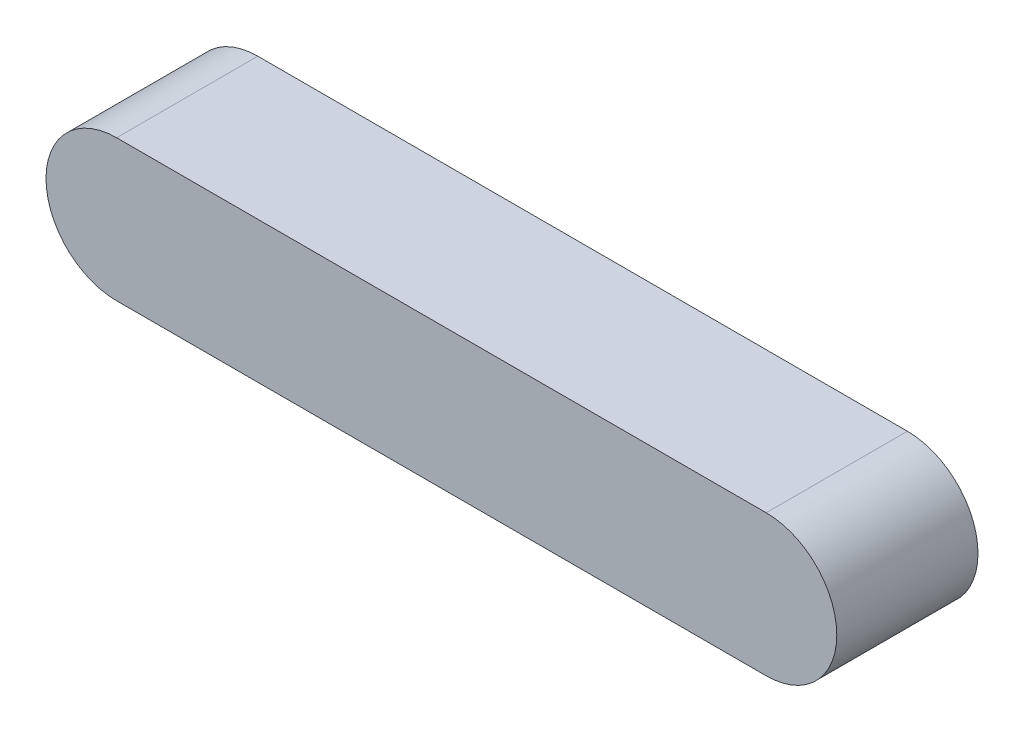
ISO-10303-21;
HEADER;
FILE_DESCRIPTION(('STEP AP214'),'2;1');
FILE_NAME('part.step','',(''),(''),'','','');
FILE_SCHEMA(('AUTOMOTIVE_DESIGN { 1 0 10303 214 1 1 1 1 }'));
ENDSEC;
DATA;
#1=APPLICATION_CONTEXT('core data for automotive mechanical design processes');
#2=APPLICATION_PROTOCOL_DEFINITION('international standard','automotive_design',2000,#1);
#3=PRODUCT_CONTEXT('',#1,'mechanical');
#4=PRODUCT('Part','Part','',(#3));
#5=PRODUCT_RELATED_PRODUCT_CATEGORY('part','',(#4));
#6=PRODUCT_DEFINITION_FORMATION('','',#4);
#7=PRODUCT_DEFINITION_CONTEXT('part definition',#1,'design');
#8=PRODUCT_DEFINITION('design','',#6,#7);
#9=PRODUCT_DEFINITION_SHAPE('','',#8);
#10=(LENGTH_UNIT() NAMED_UNIT(*) SI_UNIT(.MILLI.,.METRE.));
#11=(NAMED_UNIT(*) PLANE_ANGLE_UNIT() SI_UNIT($,.RADIAN.));
#12=(NAMED_UNIT(*) SI_UNIT($,.STERADIAN.) SOLID_ANGLE_UNIT());
#13=UNCERTAINTY_MEASURE_WITH_UNIT(LENGTH_MEASURE(1.E-05),#10,'distance_accuracy_value','');
#14=(GEOMETRIC_REPRESENTATION_CONTEXT(3) GLOBAL_UNCERTAINTY_ASSIGNED_CONTEXT((#13)) GLOBAL_UNIT_ASSIGNED_CONTEXT((#10,
#11,#12)) REPRESENTATION_CONTEXT('',''));
#15=CARTESIAN_POINT('',(0.,0.,0.));
#16=DIRECTION('',(0.,0.,1.));
#17=DIRECTION('',(1.,0.,0.));
#18=AXIS2_PLACEMENT_3D('',#15,#16,#17);
#19=CARTESIAN_POINT('',(26.7674962438812,0.,5.));
#20=DIRECTION('',(0.,0.,-1.));
#21=DIRECTION('',(-1.,0.,0.));
#22=AXIS2_PLACEMENT_3D('',#19,#20,#21);
#23=CYLINDRICAL_SURFACE('',#22,2.5);
#24=CARTESIAN_POINT('',(26.7674962438812,0.,0.));
#25=DIRECTION('',(0.,0.,1.));
#26=DIRECTION('',(1.,0.,0.));
#27=AXIS2_PLACEMENT_3D('',#24,#25,#26);
#28=CIRCLE('',#27,2.5);
#29=CARTESIAN_POINT('',(26.7674962438812,2.5,0.));
#30=VERTEX_POINT('',#29);
#31=CARTESIAN_POINT('',(26.7674962438812,-2.5,0.));
#32=VERTEX_POINT('',#31);
#33=EDGE_CURVE('E107',#30,#32,#28,.T.);
#34=ORIENTED_EDGE('',*,*,#33,.T.);
#35=DIRECTION('',(0.,0.,-1.));
#36=VECTOR('',#35,1.);
#37=CARTESIAN_POINT('',(26.7674962438812,-2.5,5.));
#38=LINE('',#37,#36);
#39=CARTESIAN_POINT('',(26.7674962438812,-2.5,5.));
#40=VERTEX_POINT('',#39);
#41=EDGE_CURVE('E11',#40,#32,#38,.T.);
#42=ORIENTED_EDGE('',*,*,#41,.F.);
#43=CARTESIAN_POINT('',(26.7674962438812,0.,5.));
#44=DIRECTION('',(0.,0.,1.));
#45=DIRECTION('',(1.,0.,0.));
#46=AXIS2_PLACEMENT_3D('',#43,#44,#45);
#47=CIRCLE('',#46,2.5);
#48=CARTESIAN_POINT('',(26.7674962438812,2.5,5.));
#49=VERTEX_POINT('',#48);
#50=EDGE_CURVE('E91',#49,#40,#47,.T.);
#51=ORIENTED_EDGE('',*,*,#50,.F.);
#52=DIRECTION('',(0.,0.,-1.));
#53=VECTOR('',#52,1.);
#54=CARTESIAN_POINT('',(26.7674962438812,2.5,5.));
#55=LINE('',#54,#53);
#56=EDGE_CURVE('E103',#49,#30,#55,.T.);
#57=ORIENTED_EDGE('',*,*,#56,.T.);
#58=EDGE_LOOP('',(#34,#42,#51,#57));
#59=FACE_BOUND('',#58,.T.);
#60=ADVANCED_FACE('F39',(#59),#23,.T.);
#61=CARTESIAN_POINT('',(26.7674962438812,-2.5,5.));
#62=DIRECTION('',(0.,1.,0.));
#63=DIRECTION('',(0.,0.,1.));
#64=AXIS2_PLACEMENT_3D('',#61,#62,#63);
#65=PLANE('',#64);
#66=DIRECTION('',(1.,0.,0.));
#67=VECTOR('',#66,1.);
#68=CARTESIAN_POINT('',(26.7674962438812,-2.5,0.));
#69=LINE('',#68,#67);
#70=CARTESIAN_POINT('',(49.7674962438811,-2.5,0.));
#71=VERTEX_POINT('',#70);
#72=EDGE_CURVE('E96',#32,#71,#69,.T.);
#73=ORIENTED_EDGE('',*,*,#72,.T.);
#74=DIRECTION('',(0.,0.,-1.));
#75=VECTOR('',#74,1.);
#76=CARTESIAN_POINT('',(49.7674962438811,-2.5,5.));
#77=LINE('',#76,#75);
#78=CARTESIAN_POINT('',(49.7674962438811,-2.5,5.));
#79=VERTEX_POINT('',#78);
#80=EDGE_CURVE('E48',#79,#71,#77,.T.);
#81=ORIENTED_EDGE('',*,*,#80,.F.);
#82=DIRECTION('',(1.,0.,0.));
#83=VECTOR('',#82,1.);
#84=CARTESIAN_POINT('',(26.7674962438812,-2.5,5.));
#85=LINE('',#84,#83);
#86=EDGE_CURVE('E86',#40,#79,#85,.T.);
#87=ORIENTED_EDGE('',*,*,#86,.F.);
#88=ORIENTED_EDGE('',*,*,#41,.T.);
#89=EDGE_LOOP('',(#73,#81,#87,#88));
#90=FACE_BOUND('',#89,.T.);
#91=ADVANCED_FACE('F95',(#90),#65,.F.);
#92=CARTESIAN_POINT('',(49.7674962438811,0.,5.));
#93=DIRECTION('',(0.,0.,-1.));
#94=DIRECTION('',(-1.,0.,0.));
#95=AXIS2_PLACEMENT_3D('',#92,#93,#94);
#96=CYLINDRICAL_SURFACE('',#95,2.5);
#97=CARTESIAN_POINT('',(49.7674962438811,0.,0.));
#98=DIRECTION('',(0.,0.,1.));
#99=DIRECTION('',(1.,0.,0.));
#100=AXIS2_PLACEMENT_3D('',#97,#98,#99);
#101=CIRCLE('',#100,2.5);
#102=CARTESIAN_POINT('',(49.7674962438811,2.5,0.));
#103=VERTEX_POINT('',#102);
#104=EDGE_CURVE('E73',#71,#103,#101,.T.);
#105=ORIENTED_EDGE('',*,*,#104,.T.);
#106=DIRECTION('',(0.,0.,-1.));
#107=VECTOR('',#106,1.);
#108=CARTESIAN_POINT('',(49.7674962438811,2.5,5.));
#109=LINE('',#108,#107);
#110=CARTESIAN_POINT('',(49.7674962438811,2.5,5.));
#111=VERTEX_POINT('',#110);
#112=EDGE_CURVE('E98',#111,#103,#109,.T.);
#113=ORIENTED_EDGE('',*,*,#112,.F.);
#114=CARTESIAN_POINT('',(49.7674962438811,0.,5.));
#115=DIRECTION('',(0.,0.,1.));
#116=DIRECTION('',(1.,0.,0.));
#117=AXIS2_PLACEMENT_3D('',#114,#115,#116);
#118=CIRCLE('',#117,2.5);
#119=EDGE_CURVE('E89',#79,#111,#118,.T.);
#120=ORIENTED_EDGE('',*,*,#119,.F.);
#121=ORIENTED_EDGE('',*,*,#80,.T.);
#122=EDGE_LOOP('',(#105,#113,#120,#121));
#123=FACE_BOUND('',#122,.T.);
#124=ADVANCED_FACE('F99',(#123),#96,.T.);
#125=CARTESIAN_POINT('',(26.7674962438812,2.5,5.));
#126=DIRECTION('',(0.,-1.,0.));
#127=DIRECTION('',(0.,0.,-1.));
#128=AXIS2_PLACEMENT_3D('',#125,#126,#127);
#129=PLANE('',#128);
#130=DIRECTION('',(-1.,0.,0.));
#131=VECTOR('',#130,1.);
#132=CARTESIAN_POINT('',(26.7674962438812,2.5,0.));
#133=LINE('',#132,#131);
#134=EDGE_CURVE('E79',#103,#30,#133,.T.);
#135=ORIENTED_EDGE('',*,*,#134,.T.);
#136=ORIENTED_EDGE('',*,*,#56,.F.);
#137=DIRECTION('',(-1.,0.,0.));
#138=VECTOR('',#137,1.);
#139=CARTESIAN_POINT('',(26.7674962438812,2.5,5.));
#140=LINE('',#139,#138);
#141=EDGE_CURVE('E56',#111,#49,#140,.T.);
#142=ORIENTED_EDGE('',*,*,#141,.F.);
#143=ORIENTED_EDGE('',*,*,#112,.T.);
#144=EDGE_LOOP('',(#135,#136,#142,#143));
#145=FACE_BOUND('',#144,.T.);
#146=ADVANCED_FACE('F120',(#145),#129,.F.);
#147=CARTESIAN_POINT('',(26.7674962438812,0.,5.));
#148=DIRECTION('',(0.,0.,1.));
#149=DIRECTION('',(1.,0.,0.));
#150=AXIS2_PLACEMENT_3D('',#147,#148,#149);
#151=PLANE('',#150);
#152=ORIENTED_EDGE('',*,*,#50,.T.);
#153=ORIENTED_EDGE('',*,*,#86,.T.);
#154=ORIENTED_EDGE('',*,*,#119,.T.);
#155=ORIENTED_EDGE('',*,*,#141,.T.);
#156=EDGE_LOOP('',(#152,#153,#154,#155));
#157=FACE_BOUND('',#156,.T.);
#158=ADVANCED_FACE('F87',(#157),#151,.T.);
#159=CARTESIAN_POINT('',(26.7674962438812,0.,0.));
#160=DIRECTION('',(0.,0.,1.));
#161=DIRECTION('',(1.,0.,0.));
#162=AXIS2_PLACEMENT_3D('',#159,#160,#161);
#163=PLANE('',#162);
#164=ORIENTED_EDGE('',*,*,#33,.F.);
#165=ORIENTED_EDGE('',*,*,#134,.F.);
#166=ORIENTED_EDGE('',*,*,#104,.F.);
#167=ORIENTED_EDGE('',*,*,#72,.F.);
#168=EDGE_LOOP('',(#164,#165,#166,#167));
#169=FACE_BOUND('',#168,.T.);
#170=ADVANCED_FACE('F123',(#169),#163,.F.);
#171=CLOSED_SHELL('',(#60,#91,#124,#146,#158,#170));
#172=MANIFOLD_SOLID_BREP('B2',#171);
#173=ADVANCED_BREP_SHAPE_REPRESENTATION('',(#18,#172),#14);
#174=SHAPE_DEFINITION_REPRESENTATION(#9,#173);
ENDSEC;
END-ISO-10303-21;
